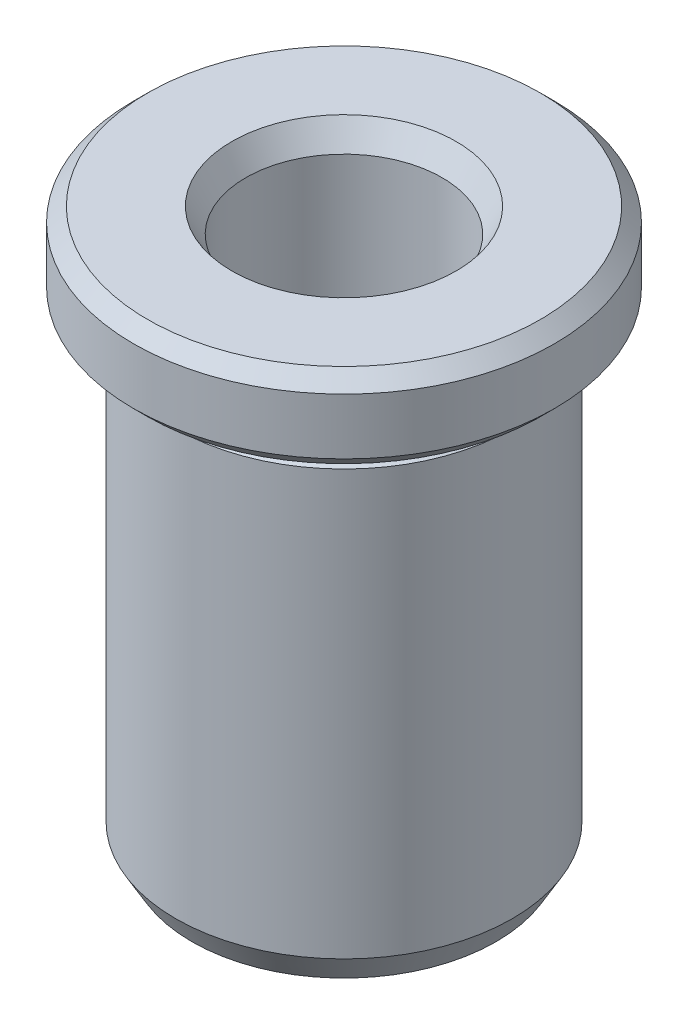
ISO-10303-21;
HEADER;
FILE_DESCRIPTION(('STEP AP214'),'2;1');
FILE_NAME('part.step','',(''),(''),'','','');
FILE_SCHEMA(('AUTOMOTIVE_DESIGN { 1 0 10303 214 1 1 1 1 }'));
ENDSEC;
DATA;
#1=APPLICATION_CONTEXT('core data for automotive mechanical design processes');
#2=APPLICATION_PROTOCOL_DEFINITION('international standard','automotive_design',2000,#1);
#3=PRODUCT_CONTEXT('',#1,'mechanical');
#4=PRODUCT('Part','Part','',(#3));
#5=PRODUCT_RELATED_PRODUCT_CATEGORY('part','',(#4));
#6=PRODUCT_DEFINITION_FORMATION('','',#4);
#7=PRODUCT_DEFINITION_CONTEXT('part definition',#1,'design');
#8=PRODUCT_DEFINITION('design','',#6,#7);
#9=PRODUCT_DEFINITION_SHAPE('','',#8);
#10=(LENGTH_UNIT() NAMED_UNIT(*) SI_UNIT(.MILLI.,.METRE.));
#11=(NAMED_UNIT(*) PLANE_ANGLE_UNIT() SI_UNIT($,.RADIAN.));
#12=(NAMED_UNIT(*) SI_UNIT($,.STERADIAN.) SOLID_ANGLE_UNIT());
#13=UNCERTAINTY_MEASURE_WITH_UNIT(LENGTH_MEASURE(1.E-05),#10,'distance_accuracy_value','');
#14=(GEOMETRIC_REPRESENTATION_CONTEXT(3) GLOBAL_UNCERTAINTY_ASSIGNED_CONTEXT((#13)) GLOBAL_UNIT_ASSIGNED_CONTEXT((#10,
#11,#12)) REPRESENTATION_CONTEXT('',''));
#15=CARTESIAN_POINT('',(0.,0.,0.));
#16=DIRECTION('',(0.,0.,1.));
#17=DIRECTION('',(1.,0.,0.));
#18=AXIS2_PLACEMENT_3D('',#15,#16,#17);
#19=CARTESIAN_POINT('',(0.,-3.,0.));
#20=DIRECTION('',(0.,-1.,0.));
#21=DIRECTION('',(0.,0.,-1.));
#22=AXIS2_PLACEMENT_3D('',#19,#20,#21);
#23=TOROIDAL_SURFACE('',#22,6.,0.75);
#24=CARTESIAN_POINT('',(0.,-3.4931885069059,0.));
#25=DIRECTION('',(0.,1.,0.));
#26=DIRECTION('',(0.,0.,1.));
#27=AXIS2_PLACEMENT_3D('',#24,#25,#26);
#28=CIRCLE('',#27,5.43496451734787);
#29=CARTESIAN_POINT('',(0.,-3.4931885069059,-5.43496451734786));
#30=VERTEX_POINT('',#29);
#31=EDGE_CURVE('E48',#30,#30,#28,.T.);
#32=ORIENTED_EDGE('',*,*,#31,.T.);
#33=EDGE_LOOP('',(#32));
#34=FACE_BOUND('',#33,.T.);
#35=CARTESIAN_POINT('',(0.,-3.,0.));
#36=DIRECTION('',(0.,-1.,0.));
#37=DIRECTION('',(0.,0.,-1.));
#38=AXIS2_PLACEMENT_3D('',#35,#36,#37);
#39=CIRCLE('',#38,6.75);
#40=CARTESIAN_POINT('',(0.,-3.,-6.75));
#41=VERTEX_POINT('',#40);
#42=EDGE_CURVE('E73',#41,#41,#39,.T.);
#43=ORIENTED_EDGE('',*,*,#42,.T.);
#44=EDGE_LOOP('',(#43));
#45=FACE_BOUND('',#44,.T.);
#46=ADVANCED_FACE('F41',(#34,#45),#23,.F.);
#47=CARTESIAN_POINT('',(0.,-3.,0.));
#48=DIRECTION('',(0.,1.,0.));
#49=DIRECTION('',(0.,0.,1.));
#50=AXIS2_PLACEMENT_3D('',#47,#48,#49);
#51=PLANE('',#50);
#52=CARTESIAN_POINT('',(0.,-3.,0.));
#53=DIRECTION('',(0.,1.,0.));
#54=DIRECTION('',(0.,0.,1.));
#55=AXIS2_PLACEMENT_3D('',#52,#53,#54);
#56=CIRCLE('',#55,7.);
#57=CARTESIAN_POINT('',(0.,-3.,7.));
#58=VERTEX_POINT('',#57);
#59=EDGE_CURVE('E70',#58,#58,#56,.F.);
#60=ORIENTED_EDGE('',*,*,#59,.T.);
#61=EDGE_LOOP('',(#60));
#62=FACE_BOUND('',#61,.T.);
#63=ORIENTED_EDGE('',*,*,#42,.F.);
#64=EDGE_LOOP('',(#63));
#65=FACE_BOUND('',#64,.T.);
#66=ADVANCED_FACE('F105',(#62,#65),#51,.F.);
#67=CARTESIAN_POINT('',(0.,0.,0.));
#68=DIRECTION('',(0.,-1.,0.));
#69=DIRECTION('',(0.,0.,-1.));
#70=AXIS2_PLACEMENT_3D('',#67,#68,#69);
#71=CYLINDRICAL_SURFACE('',#70,7.5);
#72=CARTESIAN_POINT('',(0.,-2.5,0.));
#73=DIRECTION('',(0.,1.,0.));
#74=DIRECTION('',(0.,0.,1.));
#75=AXIS2_PLACEMENT_3D('',#72,#73,#74);
#76=CIRCLE('',#75,7.5);
#77=CARTESIAN_POINT('',(0.,-2.5,7.5));
#78=VERTEX_POINT('',#77);
#79=EDGE_CURVE('E64',#78,#78,#76,.T.);
#80=ORIENTED_EDGE('',*,*,#79,.T.);
#81=EDGE_LOOP('',(#80));
#82=FACE_BOUND('',#81,.T.);
#83=CARTESIAN_POINT('',(0.,-0.5,0.));
#84=DIRECTION('',(0.,-1.,0.));
#85=DIRECTION('',(0.,0.,-1.));
#86=AXIS2_PLACEMENT_3D('',#83,#84,#85);
#87=CIRCLE('',#86,7.5);
#88=CARTESIAN_POINT('',(0.,-0.5,-7.5));
#89=VERTEX_POINT('',#88);
#90=EDGE_CURVE('E67',#89,#89,#87,.T.);
#91=ORIENTED_EDGE('',*,*,#90,.T.);
#92=EDGE_LOOP('',(#91));
#93=FACE_BOUND('',#92,.T.);
#94=ADVANCED_FACE('F92',(#82,#93),#71,.T.);
#95=CARTESIAN_POINT('',(0.,0.,0.));
#96=DIRECTION('',(0.,-1.,0.));
#97=DIRECTION('',(0.,0.,-1.));
#98=AXIS2_PLACEMENT_3D('',#95,#96,#97);
#99=PLANE('',#98);
#100=CARTESIAN_POINT('',(0.,0.,0.));
#101=DIRECTION('',(0.,1.,0.));
#102=DIRECTION('',(0.,0.,1.));
#103=AXIS2_PLACEMENT_3D('',#100,#101,#102);
#104=CIRCLE('',#103,4.);
#105=CARTESIAN_POINT('',(0.,0.,4.));
#106=VERTEX_POINT('',#105);
#107=EDGE_CURVE('E82',#106,#106,#104,.T.);
#108=ORIENTED_EDGE('',*,*,#107,.F.);
#109=EDGE_LOOP('',(#108));
#110=FACE_BOUND('',#109,.T.);
#111=CARTESIAN_POINT('',(0.,0.,0.));
#112=DIRECTION('',(0.,-1.,0.));
#113=DIRECTION('',(0.,0.,-1.));
#114=AXIS2_PLACEMENT_3D('',#111,#112,#113);
#115=CIRCLE('',#114,7.);
#116=CARTESIAN_POINT('',(0.,0.,-7.));
#117=VERTEX_POINT('',#116);
#118=EDGE_CURVE('E61',#117,#117,#115,.F.);
#119=ORIENTED_EDGE('',*,*,#118,.T.);
#120=EDGE_LOOP('',(#119));
#121=FACE_BOUND('',#120,.T.);
#122=ADVANCED_FACE('F88',(#110,#121),#99,.F.);
#123=CARTESIAN_POINT('',(0.,-20.,0.));
#124=DIRECTION('',(0.,1.,0.));
#125=DIRECTION('',(0.,0.,1.));
#126=AXIS2_PLACEMENT_3D('',#123,#124,#125);
#127=PLANE('',#126);
#128=CARTESIAN_POINT('',(0.,-20.,0.));
#129=DIRECTION('',(0.,1.,0.));
#130=DIRECTION('',(0.,0.,1.));
#131=AXIS2_PLACEMENT_3D('',#128,#129,#130);
#132=CIRCLE('',#131,5.42264973081037);
#133=CARTESIAN_POINT('',(0.,-20.,5.42264973081036));
#134=VERTEX_POINT('',#133);
#135=EDGE_CURVE('E10',#134,#134,#132,.F.);
#136=ORIENTED_EDGE('',*,*,#135,.T.);
#137=EDGE_LOOP('',(#136));
#138=FACE_BOUND('',#137,.T.);
#139=CARTESIAN_POINT('',(0.,-20.,0.));
#140=DIRECTION('',(0.,1.,0.));
#141=DIRECTION('',(0.,0.,1.));
#142=AXIS2_PLACEMENT_3D('',#139,#140,#141);
#143=CIRCLE('',#142,3.5);
#144=CARTESIAN_POINT('',(0.,-20.,3.49999999999999));
#145=VERTEX_POINT('',#144);
#146=EDGE_CURVE('E76',#145,#145,#143,.T.);
#147=ORIENTED_EDGE('',*,*,#146,.T.);
#148=EDGE_LOOP('',(#147));
#149=FACE_BOUND('',#148,.T.);
#150=ADVANCED_FACE('F91',(#138,#149),#127,.F.);
#151=CARTESIAN_POINT('',(0.,0.,0.));
#152=DIRECTION('',(0.,-1.,0.));
#153=DIRECTION('',(0.,0.,-1.));
#154=AXIS2_PLACEMENT_3D('',#151,#152,#153);
#155=CYLINDRICAL_SURFACE('',#154,6.);
#156=CARTESIAN_POINT('',(0.,-3.87284519653705,0.));
#157=DIRECTION('',(0.,-1.,0.));
#158=DIRECTION('',(0.,0.,-1.));
#159=AXIS2_PLACEMENT_3D('',#156,#157,#158);
#160=CIRCLE('',#159,6.);
#161=CARTESIAN_POINT('',(0.,-3.87284519653705,-6.));
#162=VERTEX_POINT('',#161);
#163=EDGE_CURVE('E52',#162,#162,#160,.T.);
#164=ORIENTED_EDGE('',*,*,#163,.T.);
#165=EDGE_LOOP('',(#164));
#166=FACE_BOUND('',#165,.T.);
#167=CARTESIAN_POINT('',(0.,-19.,0.));
#168=DIRECTION('',(0.,1.,0.));
#169=DIRECTION('',(0.,0.,1.));
#170=AXIS2_PLACEMENT_3D('',#167,#168,#169);
#171=CIRCLE('',#170,6.);
#172=CARTESIAN_POINT('',(0.,-19.,6.));
#173=VERTEX_POINT('',#172);
#174=EDGE_CURVE('E56',#173,#173,#171,.T.);
#175=ORIENTED_EDGE('',*,*,#174,.T.);
#176=EDGE_LOOP('',(#175));
#177=FACE_BOUND('',#176,.T.);
#178=ADVANCED_FACE('F120',(#166,#177),#155,.T.);
#179=CARTESIAN_POINT('',(0.,-3.,0.));
#180=DIRECTION('',(0.,1.,0.));
#181=DIRECTION('',(0.,0.,1.));
#182=AXIS2_PLACEMENT_3D('',#179,#180,#181);
#183=CONICAL_SURFACE('',#182,7.,0.785398163397447);
#184=ORIENTED_EDGE('',*,*,#79,.F.);
#185=EDGE_LOOP('',(#184));
#186=FACE_BOUND('',#185,.T.);
#187=ORIENTED_EDGE('',*,*,#59,.F.);
#188=EDGE_LOOP('',(#187));
#189=FACE_BOUND('',#188,.T.);
#190=ADVANCED_FACE('F100',(#186,#189),#183,.T.);
#191=CARTESIAN_POINT('',(0.,-0.5,0.));
#192=DIRECTION('',(0.,-1.,0.));
#193=DIRECTION('',(0.,0.,-1.));
#194=AXIS2_PLACEMENT_3D('',#191,#192,#193);
#195=CONICAL_SURFACE('',#194,7.5,0.785398163397448);
#196=ORIENTED_EDGE('',*,*,#118,.F.);
#197=EDGE_LOOP('',(#196));
#198=FACE_BOUND('',#197,.T.);
#199=ORIENTED_EDGE('',*,*,#90,.F.);
#200=EDGE_LOOP('',(#199));
#201=FACE_BOUND('',#200,.T.);
#202=ADVANCED_FACE('F96',(#198,#201),#195,.T.);
#203=CARTESIAN_POINT('',(0.,0.,0.));
#204=DIRECTION('',(0.,1.,0.));
#205=DIRECTION('',(0.,0.,1.));
#206=AXIS2_PLACEMENT_3D('',#203,#204,#205);
#207=CYLINDRICAL_SURFACE('',#206,3.5);
#208=ORIENTED_EDGE('',*,*,#146,.F.);
#209=EDGE_LOOP('',(#208));
#210=FACE_BOUND('',#209,.T.);
#211=CARTESIAN_POINT('',(0.,-0.866025403784443,0.));
#212=DIRECTION('',(0.,1.,0.));
#213=DIRECTION('',(0.,0.,1.));
#214=AXIS2_PLACEMENT_3D('',#211,#212,#213);
#215=CIRCLE('',#214,3.5);
#216=CARTESIAN_POINT('',(0.,-0.866025403784443,3.5));
#217=VERTEX_POINT('',#216);
#218=EDGE_CURVE('E79',#217,#217,#215,.T.);
#219=ORIENTED_EDGE('',*,*,#218,.T.);
#220=EDGE_LOOP('',(#219));
#221=FACE_BOUND('',#220,.T.);
#222=ADVANCED_FACE('F99',(#210,#221),#207,.F.);
#223=CARTESIAN_POINT('',(0.,0.,0.));
#224=DIRECTION('',(0.,1.,0.));
#225=DIRECTION('',(0.,0.,1.));
#226=AXIS2_PLACEMENT_3D('',#223,#224,#225);
#227=CONICAL_SURFACE('',#226,4.,0.523598775598299);
#228=ORIENTED_EDGE('',*,*,#218,.F.);
#229=EDGE_LOOP('',(#228));
#230=FACE_BOUND('',#229,.T.);
#231=ORIENTED_EDGE('',*,*,#107,.T.);
#232=EDGE_LOOP('',(#231));
#233=FACE_BOUND('',#232,.T.);
#234=ADVANCED_FACE('F86',(#230,#233),#227,.F.);
#235=CARTESIAN_POINT('',(0.,-3.87284519653705,0.));
#236=DIRECTION('',(0.,-1.,0.));
#237=DIRECTION('',(0.,0.,-1.));
#238=AXIS2_PLACEMENT_3D('',#235,#236,#237);
#239=CONICAL_SURFACE('',#238,6.,0.979167992842605);
#240=CARTESIAN_POINT('',(0.,-3.4931885069059,-5.43496451734786));
#241=CARTESIAN_POINT('',(0.,-3.49714326408955,-5.44085030362548));
#242=CARTESIAN_POINT('',(0.,-3.50109802127321,-5.44673608990311));
#243=CARTESIAN_POINT('',(0.,-3.50900753564053,-5.45850766245836));
#244=CARTESIAN_POINT('',(0.,-3.51296229282418,-5.46439344873599));
#245=CARTESIAN_POINT('',(0.,-3.5208718071915,-5.47616502129124));
#246=CARTESIAN_POINT('',(0.,-3.52482656437516,-5.48205080756887));
#247=CARTESIAN_POINT('',(0.,-3.53273607874247,-5.49382238012412));
#248=CARTESIAN_POINT('',(0.,-3.53669083592613,-5.49970816640175));
#249=CARTESIAN_POINT('',(0.,-3.54460035029345,-5.511479738957));
#250=CARTESIAN_POINT('',(0.,-3.54855510747711,-5.51736552523463));
#251=CARTESIAN_POINT('',(0.,-3.55646462184442,-5.52913709778988));
#252=CARTESIAN_POINT('',(0.,-3.56041937902808,-5.53502288406751));
#253=CARTESIAN_POINT('',(0.,-3.56832889339539,-5.54679445662276));
#254=CARTESIAN_POINT('',(0.,-3.57228365057905,-5.55268024290039));
#255=CARTESIAN_POINT('',(0.,-3.58019316494637,-5.56445181545564));
#256=CARTESIAN_POINT('',(0.,-3.58414792213003,-5.57033760173327));
#257=CARTESIAN_POINT('',(0.,-3.59205743649734,-5.58210917428852));
#258=CARTESIAN_POINT('',(0.,-3.596012193681,-5.58799496056615));
#259=CARTESIAN_POINT('',(0.,-3.60392170804832,-5.5997665331214));
#260=CARTESIAN_POINT('',(0.,-3.60787646523197,-5.60565231939903));
#261=CARTESIAN_POINT('',(0.,-3.61578597959929,-5.61742389195428));
#262=CARTESIAN_POINT('',(0.,-3.61974073678295,-5.62330967823191));
#263=CARTESIAN_POINT('',(0.,-3.62765025115026,-5.63508125078716));
#264=CARTESIAN_POINT('',(0.,-3.63160500833392,-5.64096703706479));
#265=CARTESIAN_POINT('',(0.,-3.63951452270124,-5.65273860962004));
#266=CARTESIAN_POINT('',(0.,-3.64346927988489,-5.65862439589767));
#267=CARTESIAN_POINT('',(0.,-3.65137879425221,-5.67039596845292));
#268=CARTESIAN_POINT('',(0.,-3.65533355143587,-5.67628175473054));
#269=CARTESIAN_POINT('',(0.,-3.66324306580318,-5.6880533272858));
#270=CARTESIAN_POINT('',(0.,-3.66719782298684,-5.69393911356342));
#271=CARTESIAN_POINT('',(0.,-3.67510733735416,-5.70571068611868));
#272=CARTESIAN_POINT('',(0.,-3.67906209453781,-5.7115964723963));
#273=CARTESIAN_POINT('',(0.,-3.68697160890513,-5.72336804495156));
#274=CARTESIAN_POINT('',(0.,-3.69092636608879,-5.72925383122918));
#275=CARTESIAN_POINT('',(0.,-3.6988358804561,-5.74102540378444));
#276=CARTESIAN_POINT('',(0.,-3.70279063763976,-5.74691119006206));
#277=CARTESIAN_POINT('',(0.,-3.71070015200708,-5.75868276261732));
#278=CARTESIAN_POINT('',(0.,-3.71465490919074,-5.76456854889494));
#279=CARTESIAN_POINT('',(0.,-3.72256442355805,-5.7763401214502));
#280=CARTESIAN_POINT('',(0.,-3.72651918074171,-5.78222590772782));
#281=CARTESIAN_POINT('',(0.,-3.73442869510902,-5.79399748028307));
#282=CARTESIAN_POINT('',(0.,-3.73838345229268,-5.7998832665607));
#283=CARTESIAN_POINT('',(0.,-3.74629296666,-5.81165483911595));
#284=CARTESIAN_POINT('',(0.,-3.75024772384366,-5.81754062539358));
#285=CARTESIAN_POINT('',(0.,-3.75815723821097,-5.82931219794883));
#286=CARTESIAN_POINT('',(0.,-3.76211199539463,-5.83519798422646));
#287=CARTESIAN_POINT('',(0.,-3.77002150976195,-5.84696955678171));
#288=CARTESIAN_POINT('',(0.,-3.7739762669456,-5.85285534305934));
#289=CARTESIAN_POINT('',(0.,-3.78188578131292,-5.86462691561459));
#290=CARTESIAN_POINT('',(0.,-3.78584053849658,-5.87051270189222));
#291=CARTESIAN_POINT('',(0.,-3.79375005286389,-5.88228427444747));
#292=CARTESIAN_POINT('',(0.,-3.79770481004755,-5.8881700607251));
#293=CARTESIAN_POINT('',(0.,-3.80561432441487,-5.89994163328035));
#294=CARTESIAN_POINT('',(0.,-3.80956908159852,-5.90582741955798));
#295=CARTESIAN_POINT('',(0.,-3.81747859596584,-5.91759899211323));
#296=CARTESIAN_POINT('',(0.,-3.8214333531495,-5.92348477839086));
#297=CARTESIAN_POINT('',(0.,-3.82934286751681,-5.93525635094611));
#298=CARTESIAN_POINT('',(0.,-3.83329762470047,-5.94114213722374));
#299=CARTESIAN_POINT('',(0.,-3.84120713906779,-5.95291370977899));
#300=CARTESIAN_POINT('',(0.,-3.84516189625144,-5.95879949605662));
#301=CARTESIAN_POINT('',(0.,-3.85307141061876,-5.97057106861187));
#302=CARTESIAN_POINT('',(0.,-3.85702616780242,-5.9764568548895));
#303=CARTESIAN_POINT('',(0.,-3.86493568216973,-5.98822842744475));
#304=CARTESIAN_POINT('',(0.,-3.86889043935339,-5.99411421372237));
#305=CARTESIAN_POINT('',(0.,-3.87284519653705,-6.));
#306=B_SPLINE_CURVE_WITH_KNOTS('',3,(#240,#241,#242,#243,#244,#245,#246,#247,#248,#249,#250,
#251,#252,#253,#254,#255,#256,#257,#258,#259,#260,#261,#262,#263,#264,#265,#266,#267,#268,#269,
#270,#271,#272,#273,#274,#275,#276,#277,#278,#279,#280,#281,#282,#283,#284,#285,#286,#287,#288,
#289,#290,#291,#292,#293,#294,#295,#296,#297,#298,#299,#300,#301,#302,#303,#304,#305),
.UNSPECIFIED.,.F.,.F.,(4,2,2,2,2,2,2,2,2,2,2,2,2,2,2,2,2,2,2,2,2,2,2,2,2,2,2,2,2,2,2,2,4),(0.,
0.0212730641983775,0.0425461283967558,0.0638191925951336,0.0850922567935111,0.106365320991889,
0.127638385190267,0.148911449388645,0.170184513587023,0.1914575777854,0.212730641983779,
0.234003706182156,0.255276770380535,0.276549834578913,0.29782289877729,0.319095962975668,
0.340369027174046,0.361642091372424,0.382915155570802,0.40418821976918,0.425461283967558,
0.446734348165935,0.468007412364314,0.489280476562692,0.510553540761069,0.531826604959447,
0.553099669157825,0.574372733356203,0.595645797554581,0.616918861752959,0.638191925951337,
0.659464990149714,0.680738054348092),.UNSPECIFIED.);
#307=EDGE_CURVE('BSEAM122',#30,#162,#306,.T.);
#308=ORIENTED_EDGE('',*,*,#31,.F.);
#309=ORIENTED_EDGE('',*,*,#163,.F.);
#310=ORIENTED_EDGE('',*,*,#307,.T.);
#311=ORIENTED_EDGE('',*,*,#307,.F.);
#312=EDGE_LOOP('',(#308,#310,#309,#311));
#313=FACE_BOUND('',#312,.T.);
#314=ADVANCED_FACE('F122',(#313),#239,.T.);
#315=CARTESIAN_POINT('',(0.,-20.,0.));
#316=DIRECTION('',(0.,1.,0.));
#317=DIRECTION('',(0.,0.,1.));
#318=AXIS2_PLACEMENT_3D('',#315,#316,#317);
#319=CONICAL_SURFACE('',#318,5.42264973081037,0.523598775598297);
#320=ORIENTED_EDGE('',*,*,#174,.F.);
#321=EDGE_LOOP('',(#320));
#322=FACE_BOUND('',#321,.T.);
#323=ORIENTED_EDGE('',*,*,#135,.F.);
#324=EDGE_LOOP('',(#323));
#325=FACE_BOUND('',#324,.T.);
#326=ADVANCED_FACE('F43',(#322,#325),#319,.T.);
#327=CLOSED_SHELL('',(#46,#66,#94,#122,#150,#178,#190,#202,#222,#234,#314,#326));
#328=MANIFOLD_SOLID_BREP('B2',#327);
#329=ADVANCED_BREP_SHAPE_REPRESENTATION('',(#18,#328),#14);
#330=SHAPE_DEFINITION_REPRESENTATION(#9,#329);
ENDSEC;
END-ISO-10303-21;
